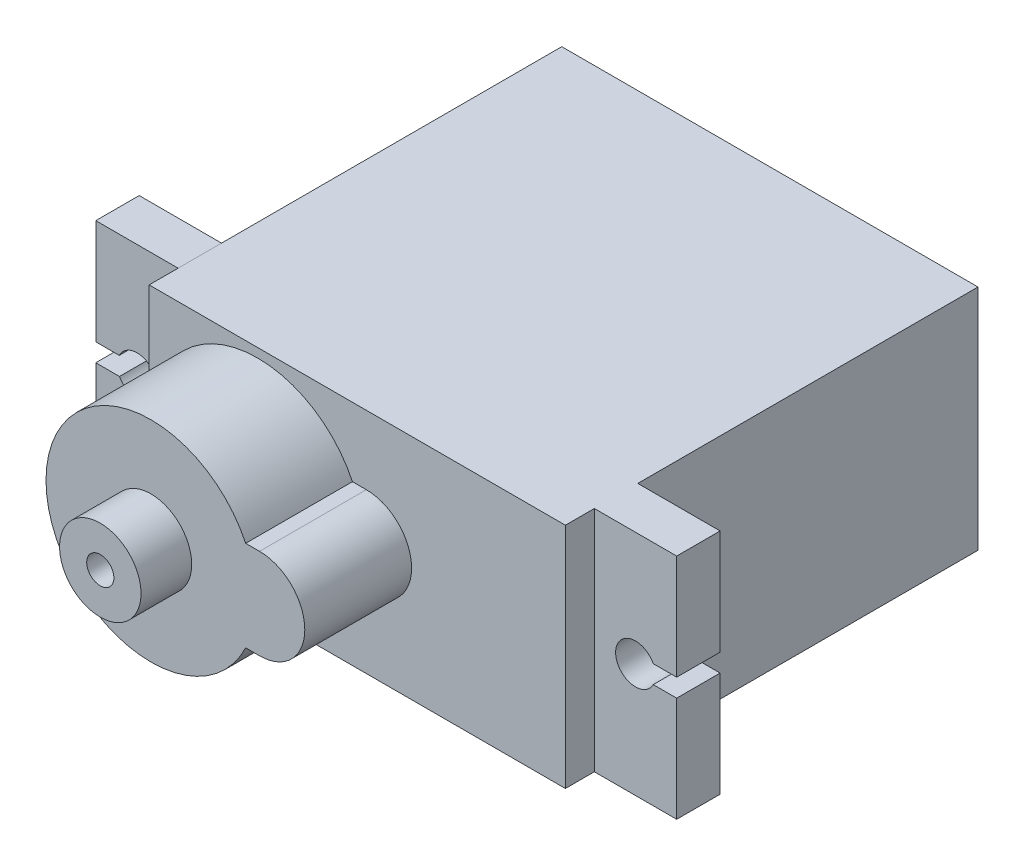
ISO-10303-21;
HEADER;
FILE_DESCRIPTION(('STEP AP214'),'2;1');
FILE_NAME('part.step','',(''),(''),'','','');
FILE_SCHEMA(('AUTOMOTIVE_DESIGN { 1 0 10303 214 1 1 1 1 }'));
ENDSEC;
DATA;
#1=APPLICATION_CONTEXT('core data for automotive mechanical design processes');
#2=APPLICATION_PROTOCOL_DEFINITION('international standard','automotive_design',2000,#1);
#3=PRODUCT_CONTEXT('',#1,'mechanical');
#4=PRODUCT('Part','Part','',(#3));
#5=PRODUCT_RELATED_PRODUCT_CATEGORY('part','',(#4));
#6=PRODUCT_DEFINITION_FORMATION('','',#4);
#7=PRODUCT_DEFINITION_CONTEXT('part definition',#1,'design');
#8=PRODUCT_DEFINITION('design','',#6,#7);
#9=PRODUCT_DEFINITION_SHAPE('','',#8);
#10=(LENGTH_UNIT() NAMED_UNIT(*) SI_UNIT(.MILLI.,.METRE.));
#11=(NAMED_UNIT(*) PLANE_ANGLE_UNIT() SI_UNIT($,.RADIAN.));
#12=(NAMED_UNIT(*) SI_UNIT($,.STERADIAN.) SOLID_ANGLE_UNIT());
#13=UNCERTAINTY_MEASURE_WITH_UNIT(LENGTH_MEASURE(1.E-05),#10,'distance_accuracy_value','');
#14=(GEOMETRIC_REPRESENTATION_CONTEXT(3) GLOBAL_UNCERTAINTY_ASSIGNED_CONTEXT((#13)) GLOBAL_UNIT_ASSIGNED_CONTEXT((#10,
#11,#12)) REPRESENTATION_CONTEXT('',''));
#15=CARTESIAN_POINT('',(0.,0.,0.));
#16=DIRECTION('',(0.,0.,1.));
#17=DIRECTION('',(1.,0.,0.));
#18=AXIS2_PLACEMENT_3D('',#15,#16,#17);
#19=CARTESIAN_POINT('',(11.5,-6.3,0.));
#20=DIRECTION('',(0.,0.,1.));
#21=DIRECTION('',(1.,0.,0.));
#22=AXIS2_PLACEMENT_3D('',#19,#20,#21);
#23=PLANE('',#22);
#24=DIRECTION('',(0.,-1.,0.));
#25=VECTOR('',#24,1.);
#26=CARTESIAN_POINT('',(0.,0.,0.));
#27=LINE('',#26,#25);
#28=CARTESIAN_POINT('',(0.,0.,0.));
#29=VERTEX_POINT('',#28);
#30=CARTESIAN_POINT('',(0.,-12.6,0.));
#31=VERTEX_POINT('',#30);
#32=EDGE_CURVE('E20',#29,#31,#27,.T.);
#33=ORIENTED_EDGE('',*,*,#32,.F.);
#34=DIRECTION('',(-1.,0.,0.));
#35=VECTOR('',#34,1.);
#36=CARTESIAN_POINT('',(23.,0.,0.));
#37=LINE('',#36,#35);
#38=CARTESIAN_POINT('',(23.,0.,0.));
#39=VERTEX_POINT('',#38);
#40=EDGE_CURVE('E426',#39,#29,#37,.T.);
#41=ORIENTED_EDGE('',*,*,#40,.F.);
#42=DIRECTION('',(0.,1.,0.));
#43=VECTOR('',#42,1.);
#44=CARTESIAN_POINT('',(23.,-12.6,0.));
#45=LINE('',#44,#43);
#46=CARTESIAN_POINT('',(23.,-12.6,0.));
#47=VERTEX_POINT('',#46);
#48=EDGE_CURVE('E27',#47,#39,#45,.T.);
#49=ORIENTED_EDGE('',*,*,#48,.F.);
#50=DIRECTION('',(1.,0.,0.));
#51=VECTOR('',#50,1.);
#52=CARTESIAN_POINT('',(0.,-12.6,0.));
#53=LINE('',#52,#51);
#54=EDGE_CURVE('E10',#31,#47,#53,.T.);
#55=ORIENTED_EDGE('',*,*,#54,.F.);
#56=EDGE_LOOP('',(#33,#41,#49,#55));
#57=FACE_BOUND('',#56,.T.);
#58=ADVANCED_FACE('F16',(#57),#23,.F.);
#59=CARTESIAN_POINT('',(11.5,-12.6,0.));
#60=DIRECTION('',(0.,-1.,0.));
#61=DIRECTION('',(0.,0.,-1.));
#62=AXIS2_PLACEMENT_3D('',#59,#60,#61);
#63=PLANE('',#62);
#64=DIRECTION('',(0.,0.,1.));
#65=VECTOR('',#64,1.);
#66=CARTESIAN_POINT('',(23.,-12.6,0.));
#67=LINE('',#66,#65);
#68=CARTESIAN_POINT('',(23.,-12.6,18.8));
#69=VERTEX_POINT('',#68);
#70=EDGE_CURVE('E192',#47,#69,#67,.T.);
#71=ORIENTED_EDGE('',*,*,#70,.T.);
#72=DIRECTION('',(1.,0.,0.));
#73=VECTOR('',#72,1.);
#74=CARTESIAN_POINT('',(0.,-12.6,18.8));
#75=LINE('',#74,#73);
#76=CARTESIAN_POINT('',(27.55,-12.6,18.8));
#77=VERTEX_POINT('',#76);
#78=EDGE_CURVE('E302',#69,#77,#75,.T.);
#79=ORIENTED_EDGE('',*,*,#78,.T.);
#80=DIRECTION('',(0.,0.,1.));
#81=VECTOR('',#80,1.);
#82=CARTESIAN_POINT('',(27.55,-12.6,18.8));
#83=LINE('',#82,#81);
#84=CARTESIAN_POINT('',(27.55,-12.6,21.2));
#85=VERTEX_POINT('',#84);
#86=EDGE_CURVE('E364',#77,#85,#83,.T.);
#87=ORIENTED_EDGE('',*,*,#86,.T.);
#88=DIRECTION('',(-1.,0.,0.));
#89=VECTOR('',#88,1.);
#90=CARTESIAN_POINT('',(23.,-12.6,21.2));
#91=LINE('',#90,#89);
#92=CARTESIAN_POINT('',(23.,-12.6,21.2));
#93=VERTEX_POINT('',#92);
#94=EDGE_CURVE('E428',#85,#93,#91,.T.);
#95=ORIENTED_EDGE('',*,*,#94,.T.);
#96=DIRECTION('',(0.,0.,1.));
#97=VECTOR('',#96,1.);
#98=CARTESIAN_POINT('',(23.,-12.6,21.2));
#99=LINE('',#98,#97);
#100=CARTESIAN_POINT('',(23.,-12.6,22.8));
#101=VERTEX_POINT('',#100);
#102=EDGE_CURVE('E393',#93,#101,#99,.T.);
#103=ORIENTED_EDGE('',*,*,#102,.T.);
#104=DIRECTION('',(-1.,0.,0.));
#105=VECTOR('',#104,1.);
#106=CARTESIAN_POINT('',(0.,-12.6,22.8));
#107=LINE('',#106,#105);
#108=CARTESIAN_POINT('',(0.,-12.6,22.8));
#109=VERTEX_POINT('',#108);
#110=EDGE_CURVE('E339',#101,#109,#107,.T.);
#111=ORIENTED_EDGE('',*,*,#110,.T.);
#112=DIRECTION('',(0.,0.,1.));
#113=VECTOR('',#112,1.);
#114=CARTESIAN_POINT('',(0.,-12.6,21.2));
#115=LINE('',#114,#113);
#116=CARTESIAN_POINT('',(0.,-12.6,21.2));
#117=VERTEX_POINT('',#116);
#118=EDGE_CURVE('E284',#117,#109,#115,.T.);
#119=ORIENTED_EDGE('',*,*,#118,.F.);
#120=DIRECTION('',(0.,0.,1.));
#121=VECTOR('',#120,1.);
#122=CARTESIAN_POINT('',(0.,-12.6,18.8));
#123=LINE('',#122,#121);
#124=CARTESIAN_POINT('',(0.,-12.6,18.8));
#125=VERTEX_POINT('',#124);
#126=EDGE_CURVE('E277',#125,#117,#123,.T.);
#127=ORIENTED_EDGE('',*,*,#126,.F.);
#128=DIRECTION('',(0.,0.,1.));
#129=VECTOR('',#128,1.);
#130=CARTESIAN_POINT('',(0.,-12.6,0.));
#131=LINE('',#130,#129);
#132=EDGE_CURVE('E281',#31,#125,#131,.T.);
#133=ORIENTED_EDGE('',*,*,#132,.F.);
#134=ORIENTED_EDGE('',*,*,#54,.T.);
#135=EDGE_LOOP('',(#71,#79,#87,#95,#103,#111,#119,#127,#133,#134));
#136=FACE_BOUND('',#135,.T.);
#137=ADVANCED_FACE('F279',(#136),#63,.T.);
#138=CARTESIAN_POINT('',(23.,-6.3,0.));
#139=DIRECTION('',(1.,0.,0.));
#140=DIRECTION('',(0.,1.,0.));
#141=AXIS2_PLACEMENT_3D('',#138,#139,#140);
#142=PLANE('',#141);
#143=DIRECTION('',(0.,-1.,0.));
#144=VECTOR('',#143,1.);
#145=CARTESIAN_POINT('',(23.,-12.6,18.8));
#146=LINE('',#145,#144);
#147=CARTESIAN_POINT('',(23.,0.,18.8));
#148=VERTEX_POINT('',#147);
#149=EDGE_CURVE('E338',#148,#69,#146,.T.);
#150=ORIENTED_EDGE('',*,*,#149,.T.);
#151=ORIENTED_EDGE('',*,*,#70,.F.);
#152=ORIENTED_EDGE('',*,*,#48,.T.);
#153=DIRECTION('',(0.,0.,1.));
#154=VECTOR('',#153,1.);
#155=CARTESIAN_POINT('',(23.,0.,0.));
#156=LINE('',#155,#154);
#157=EDGE_CURVE('E423',#39,#148,#156,.T.);
#158=ORIENTED_EDGE('',*,*,#157,.T.);
#159=EDGE_LOOP('',(#150,#151,#152,#158));
#160=FACE_BOUND('',#159,.T.);
#161=ADVANCED_FACE('F624',(#160),#142,.T.);
#162=CARTESIAN_POINT('',(11.5,0.,0.));
#163=DIRECTION('',(0.,1.,0.));
#164=DIRECTION('',(1.,0.,0.));
#165=AXIS2_PLACEMENT_3D('',#162,#163,#164);
#166=PLANE('',#165);
#167=DIRECTION('',(0.,0.,1.));
#168=VECTOR('',#167,1.);
#169=CARTESIAN_POINT('',(0.,0.,0.));
#170=LINE('',#169,#168);
#171=CARTESIAN_POINT('',(0.,0.,18.8));
#172=VERTEX_POINT('',#171);
#173=EDGE_CURVE('E319',#29,#172,#170,.T.);
#174=ORIENTED_EDGE('',*,*,#173,.T.);
#175=DIRECTION('',(0.,0.,1.));
#176=VECTOR('',#175,1.);
#177=CARTESIAN_POINT('',(0.,0.,18.8));
#178=LINE('',#177,#176);
#179=CARTESIAN_POINT('',(0.,0.,21.2));
#180=VERTEX_POINT('',#179);
#181=EDGE_CURVE('E344',#172,#180,#178,.T.);
#182=ORIENTED_EDGE('',*,*,#181,.T.);
#183=DIRECTION('',(0.,0.,1.));
#184=VECTOR('',#183,1.);
#185=CARTESIAN_POINT('',(0.,0.,21.2));
#186=LINE('',#185,#184);
#187=CARTESIAN_POINT('',(0.,0.,22.8));
#188=VERTEX_POINT('',#187);
#189=EDGE_CURVE('E486',#180,#188,#186,.T.);
#190=ORIENTED_EDGE('',*,*,#189,.T.);
#191=DIRECTION('',(1.,0.,0.));
#192=VECTOR('',#191,1.);
#193=CARTESIAN_POINT('',(23.,0.,22.8));
#194=LINE('',#193,#192);
#195=CARTESIAN_POINT('',(23.,0.,22.8));
#196=VERTEX_POINT('',#195);
#197=EDGE_CURVE('E343',#188,#196,#194,.T.);
#198=ORIENTED_EDGE('',*,*,#197,.T.);
#199=DIRECTION('',(0.,0.,1.));
#200=VECTOR('',#199,1.);
#201=CARTESIAN_POINT('',(23.,0.,21.2));
#202=LINE('',#201,#200);
#203=CARTESIAN_POINT('',(23.,0.,21.2));
#204=VERTEX_POINT('',#203);
#205=EDGE_CURVE('E412',#204,#196,#202,.T.);
#206=ORIENTED_EDGE('',*,*,#205,.F.);
#207=DIRECTION('',(1.,0.,0.));
#208=VECTOR('',#207,1.);
#209=CARTESIAN_POINT('',(23.,0.,21.2));
#210=LINE('',#209,#208);
#211=CARTESIAN_POINT('',(27.55,0.,21.2));
#212=VERTEX_POINT('',#211);
#213=EDGE_CURVE('E427',#204,#212,#210,.T.);
#214=ORIENTED_EDGE('',*,*,#213,.T.);
#215=DIRECTION('',(0.,0.,1.));
#216=VECTOR('',#215,1.);
#217=CARTESIAN_POINT('',(27.55,0.,18.8));
#218=LINE('',#217,#216);
#219=CARTESIAN_POINT('',(27.55,0.,18.8));
#220=VERTEX_POINT('',#219);
#221=EDGE_CURVE('E183',#220,#212,#218,.T.);
#222=ORIENTED_EDGE('',*,*,#221,.F.);
#223=DIRECTION('',(-1.,0.,0.));
#224=VECTOR('',#223,1.);
#225=CARTESIAN_POINT('',(27.55,0.,18.8));
#226=LINE('',#225,#224);
#227=EDGE_CURVE('E334',#220,#148,#226,.T.);
#228=ORIENTED_EDGE('',*,*,#227,.T.);
#229=ORIENTED_EDGE('',*,*,#157,.F.);
#230=ORIENTED_EDGE('',*,*,#40,.T.);
#231=EDGE_LOOP('',(#174,#182,#190,#198,#206,#214,#222,#228,#229,#230));
#232=FACE_BOUND('',#231,.T.);
#233=ADVANCED_FACE('F594',(#232),#166,.T.);
#234=CARTESIAN_POINT('',(11.4981211475471,-6.29913591463566,21.2));
#235=DIRECTION('',(0.,0.,1.));
#236=DIRECTION('',(0.,-1.,0.));
#237=AXIS2_PLACEMENT_3D('',#234,#235,#236);
#238=PLANE('',#237);
#239=DIRECTION('',(0.,-1.,0.));
#240=VECTOR('',#239,1.);
#241=CARTESIAN_POINT('',(23.,-6.29956795731783,21.2));
#242=LINE('',#241,#240);
#243=EDGE_CURVE('E417',#204,#93,#242,.T.);
#244=ORIENTED_EDGE('',*,*,#243,.T.);
#245=ORIENTED_EDGE('',*,*,#94,.F.);
#246=DIRECTION('',(0.,-1.,0.));
#247=VECTOR('',#246,1.);
#248=CARTESIAN_POINT('',(27.55,-12.6,21.2));
#249=LINE('',#248,#247);
#250=CARTESIAN_POINT('',(27.55,-6.8,21.2));
#251=VERTEX_POINT('',#250);
#252=EDGE_CURVE('E360',#251,#85,#249,.T.);
#253=ORIENTED_EDGE('',*,*,#252,.F.);
#254=DIRECTION('',(1.,0.,0.));
#255=VECTOR('',#254,1.);
#256=CARTESIAN_POINT('',(27.55,-6.8,21.2));
#257=LINE('',#256,#255);
#258=CARTESIAN_POINT('',(26.2547958971133,-6.8,21.2));
#259=VERTEX_POINT('',#258);
#260=EDGE_CURVE('E398',#259,#251,#257,.T.);
#261=ORIENTED_EDGE('',*,*,#260,.F.);
#262=CARTESIAN_POINT('',(25.275,-6.3,21.2));
#263=DIRECTION('',(0.,0.,1.));
#264=DIRECTION('',(1.,0.,0.));
#265=AXIS2_PLACEMENT_3D('',#262,#263,#264);
#266=CIRCLE('',#265,1.1);
#267=CARTESIAN_POINT('',(26.2547958971133,-5.8,21.2));
#268=VERTEX_POINT('',#267);
#269=EDGE_CURVE('E411',#268,#259,#266,.T.);
#270=ORIENTED_EDGE('',*,*,#269,.F.);
#271=DIRECTION('',(-1.,0.,0.));
#272=VECTOR('',#271,1.);
#273=CARTESIAN_POINT('',(26.2547958971133,-5.8,21.2));
#274=LINE('',#273,#272);
#275=CARTESIAN_POINT('',(27.55,-5.8,21.2));
#276=VERTEX_POINT('',#275);
#277=EDGE_CURVE('E373',#276,#268,#274,.T.);
#278=ORIENTED_EDGE('',*,*,#277,.F.);
#279=DIRECTION('',(0.,-1.,0.));
#280=VECTOR('',#279,1.);
#281=CARTESIAN_POINT('',(27.55,-5.8,21.2));
#282=LINE('',#281,#280);
#283=EDGE_CURVE('E348',#212,#276,#282,.T.);
#284=ORIENTED_EDGE('',*,*,#283,.F.);
#285=ORIENTED_EDGE('',*,*,#213,.F.);
#286=EDGE_LOOP('',(#244,#245,#253,#261,#270,#278,#284,#285));
#287=FACE_BOUND('',#286,.T.);
#288=ADVANCED_FACE('F613',(#287),#238,.T.);
#289=CARTESIAN_POINT('',(27.55,-9.7,18.8));
#290=DIRECTION('',(1.,0.,0.));
#291=DIRECTION('',(0.,-1.,0.));
#292=AXIS2_PLACEMENT_3D('',#289,#290,#291);
#293=PLANE('',#292);
#294=ORIENTED_EDGE('',*,*,#252,.T.);
#295=ORIENTED_EDGE('',*,*,#86,.F.);
#296=DIRECTION('',(0.,1.,0.));
#297=VECTOR('',#296,1.);
#298=CARTESIAN_POINT('',(27.55,-12.6,18.8));
#299=LINE('',#298,#297);
#300=CARTESIAN_POINT('',(27.55,-6.8,18.8));
#301=VERTEX_POINT('',#300);
#302=EDGE_CURVE('E384',#77,#301,#299,.T.);
#303=ORIENTED_EDGE('',*,*,#302,.T.);
#304=DIRECTION('',(0.,0.,1.));
#305=VECTOR('',#304,1.);
#306=CARTESIAN_POINT('',(27.55,-6.8,18.8));
#307=LINE('',#306,#305);
#308=EDGE_CURVE('E365',#301,#251,#307,.T.);
#309=ORIENTED_EDGE('',*,*,#308,.T.);
#310=EDGE_LOOP('',(#294,#295,#303,#309));
#311=FACE_BOUND('',#310,.T.);
#312=ADVANCED_FACE('F925',(#311),#293,.T.);
#313=CARTESIAN_POINT('',(26.9023979485566,-6.8,18.8));
#314=DIRECTION('',(0.,1.,0.));
#315=DIRECTION('',(1.,0.,0.));
#316=AXIS2_PLACEMENT_3D('',#313,#314,#315);
#317=PLANE('',#316);
#318=ORIENTED_EDGE('',*,*,#260,.T.);
#319=ORIENTED_EDGE('',*,*,#308,.F.);
#320=DIRECTION('',(-1.,0.,0.));
#321=VECTOR('',#320,1.);
#322=CARTESIAN_POINT('',(27.55,-6.8,18.8));
#323=LINE('',#322,#321);
#324=CARTESIAN_POINT('',(26.2547958971133,-6.8,18.8));
#325=VERTEX_POINT('',#324);
#326=EDGE_CURVE('E387',#301,#325,#323,.T.);
#327=ORIENTED_EDGE('',*,*,#326,.T.);
#328=DIRECTION('',(0.,0.,1.));
#329=VECTOR('',#328,1.);
#330=CARTESIAN_POINT('',(26.2547958971133,-6.8,18.8));
#331=LINE('',#330,#329);
#332=EDGE_CURVE('E407',#325,#259,#331,.T.);
#333=ORIENTED_EDGE('',*,*,#332,.T.);
#334=EDGE_LOOP('',(#318,#319,#327,#333));
#335=FACE_BOUND('',#334,.T.);
#336=ADVANCED_FACE('F928',(#335),#317,.T.);
#337=CARTESIAN_POINT('',(25.275,-6.3,18.8));
#338=DIRECTION('',(0.,0.,1.));
#339=DIRECTION('',(1.,0.,0.));
#340=AXIS2_PLACEMENT_3D('',#337,#338,#339);
#341=CYLINDRICAL_SURFACE('',#340,1.1);
#342=ORIENTED_EDGE('',*,*,#269,.T.);
#343=ORIENTED_EDGE('',*,*,#332,.F.);
#344=CARTESIAN_POINT('',(25.275,-6.3,18.8));
#345=DIRECTION('',(0.,0.,1.));
#346=DIRECTION('',(1.,0.,0.));
#347=AXIS2_PLACEMENT_3D('',#344,#345,#346);
#348=CIRCLE('',#347,1.1);
#349=CARTESIAN_POINT('',(26.2547958971133,-5.8,18.8));
#350=VERTEX_POINT('',#349);
#351=EDGE_CURVE('E422',#350,#325,#348,.T.);
#352=ORIENTED_EDGE('',*,*,#351,.F.);
#353=DIRECTION('',(0.,0.,1.));
#354=VECTOR('',#353,1.);
#355=CARTESIAN_POINT('',(26.2547958971133,-5.8,18.8));
#356=LINE('',#355,#354);
#357=EDGE_CURVE('E377',#350,#268,#356,.T.);
#358=ORIENTED_EDGE('',*,*,#357,.T.);
#359=EDGE_LOOP('',(#342,#343,#352,#358));
#360=FACE_BOUND('',#359,.T.);
#361=ADVANCED_FACE('F942',(#360),#341,.F.);
#362=CARTESIAN_POINT('',(26.9023979485566,-5.8,18.8));
#363=DIRECTION('',(0.,-1.,0.));
#364=DIRECTION('',(-1.,0.,0.));
#365=AXIS2_PLACEMENT_3D('',#362,#363,#364);
#366=PLANE('',#365);
#367=ORIENTED_EDGE('',*,*,#277,.T.);
#368=ORIENTED_EDGE('',*,*,#357,.F.);
#369=DIRECTION('',(1.,0.,0.));
#370=VECTOR('',#369,1.);
#371=CARTESIAN_POINT('',(26.2547958971133,-5.8,18.8));
#372=LINE('',#371,#370);
#373=CARTESIAN_POINT('',(27.55,-5.8,18.8));
#374=VERTEX_POINT('',#373);
#375=EDGE_CURVE('E418',#350,#374,#372,.T.);
#376=ORIENTED_EDGE('',*,*,#375,.T.);
#377=DIRECTION('',(0.,0.,1.));
#378=VECTOR('',#377,1.);
#379=CARTESIAN_POINT('',(27.55,-5.8,18.8));
#380=LINE('',#379,#378);
#381=EDGE_CURVE('E406',#374,#276,#380,.T.);
#382=ORIENTED_EDGE('',*,*,#381,.T.);
#383=EDGE_LOOP('',(#367,#368,#376,#382));
#384=FACE_BOUND('',#383,.T.);
#385=ADVANCED_FACE('F615',(#384),#366,.T.);
#386=CARTESIAN_POINT('',(27.55,-2.9,18.8));
#387=DIRECTION('',(1.,0.,0.));
#388=DIRECTION('',(0.,-1.,0.));
#389=AXIS2_PLACEMENT_3D('',#386,#387,#388);
#390=PLANE('',#389);
#391=ORIENTED_EDGE('',*,*,#283,.T.);
#392=ORIENTED_EDGE('',*,*,#381,.F.);
#393=DIRECTION('',(0.,1.,0.));
#394=VECTOR('',#393,1.);
#395=CARTESIAN_POINT('',(27.55,-5.8,18.8));
#396=LINE('',#395,#394);
#397=EDGE_CURVE('E337',#374,#220,#396,.T.);
#398=ORIENTED_EDGE('',*,*,#397,.T.);
#399=ORIENTED_EDGE('',*,*,#221,.T.);
#400=EDGE_LOOP('',(#391,#392,#398,#399));
#401=FACE_BOUND('',#400,.T.);
#402=ADVANCED_FACE('F610',(#401),#390,.T.);
#403=CARTESIAN_POINT('',(-2.27499999862206,7.91809040237242E-05,18.8));
#404=DIRECTION('',(3.48047929774612E-05,0.999999999394313,0.));
#405=DIRECTION('',(0.,0.,-1.));
#406=AXIS2_PLACEMENT_3D('',#403,#404,#405);
#407=PLANE('',#406);
#408=DIRECTION('',(0.999999999394313,-3.48047929774612E-05,0.));
#409=VECTOR('',#408,1.);
#410=CARTESIAN_POINT('',(0.,0.,21.2));
#411=LINE('',#410,#409);
#412=CARTESIAN_POINT('',(-4.54999999724413,0.000158361808047448,21.2));
#413=VERTEX_POINT('',#412);
#414=EDGE_CURVE('E342',#413,#180,#411,.T.);
#415=ORIENTED_EDGE('',*,*,#414,.T.);
#416=ORIENTED_EDGE('',*,*,#181,.F.);
#417=DIRECTION('',(-0.999999999394313,3.48047929774612E-05,0.));
#418=VECTOR('',#417,1.);
#419=CARTESIAN_POINT('',(0.,0.,18.8));
#420=LINE('',#419,#418);
#421=CARTESIAN_POINT('',(-4.54999999724413,0.000158361808047448,18.8));
#422=VERTEX_POINT('',#421);
#423=EDGE_CURVE('E316',#172,#422,#420,.T.);
#424=ORIENTED_EDGE('',*,*,#423,.T.);
#425=DIRECTION('',(0.,0.,1.));
#426=VECTOR('',#425,1.);
#427=CARTESIAN_POINT('',(-4.54999999724413,0.000158361808047448,18.8));
#428=LINE('',#427,#426);
#429=EDGE_CURVE('E349',#422,#413,#428,.T.);
#430=ORIENTED_EDGE('',*,*,#429,.T.);
#431=EDGE_LOOP('',(#415,#416,#424,#430));
#432=FACE_BOUND('',#431,.T.);
#433=ADVANCED_FACE('F951',(#432),#407,.T.);
#434=CARTESIAN_POINT('',(-4.55010094105764,-2.9001264788859,18.8));
#435=DIRECTION('',(-0.999999999394313,3.48047929774613E-05,0.));
#436=DIRECTION('',(0.,0.,1.));
#437=AXIS2_PLACEMENT_3D('',#434,#435,#436);
#438=PLANE('',#437);
#439=DIRECTION('',(3.48047929774613E-05,0.999999999394313,0.));
#440=VECTOR('',#439,1.);
#441=CARTESIAN_POINT('',(-4.54999999724413,0.000158361808047448,21.2));
#442=LINE('',#441,#440);
#443=CARTESIAN_POINT('',(-4.55020188487116,-5.80041131957985,21.2));
#444=VERTEX_POINT('',#443);
#445=EDGE_CURVE('E355',#444,#413,#442,.T.);
#446=ORIENTED_EDGE('',*,*,#445,.T.);
#447=ORIENTED_EDGE('',*,*,#429,.F.);
#448=DIRECTION('',(-3.48047929774613E-05,-0.999999999394313,0.));
#449=VECTOR('',#448,1.);
#450=CARTESIAN_POINT('',(-4.54999999724413,0.000158361808047448,18.8));
#451=LINE('',#450,#449);
#452=CARTESIAN_POINT('',(-4.55020188487116,-5.80041131957985,18.8));
#453=VERTEX_POINT('',#452);
#454=EDGE_CURVE('E433',#422,#453,#451,.T.);
#455=ORIENTED_EDGE('',*,*,#454,.T.);
#456=DIRECTION('',(0.,0.,1.));
#457=VECTOR('',#456,1.);
#458=CARTESIAN_POINT('',(-4.55020188487116,-5.80041131957985,18.8));
#459=LINE('',#458,#457);
#460=EDGE_CURVE('E476',#453,#444,#459,.T.);
#461=ORIENTED_EDGE('',*,*,#460,.T.);
#462=EDGE_LOOP('',(#446,#447,#455,#461));
#463=FACE_BOUND('',#462,.T.);
#464=ADVANCED_FACE('F954',(#463),#438,.T.);
#465=CARTESIAN_POINT('',(-3.90245260923942,-5.80041131957985,18.8));
#466=DIRECTION('',(0.,-1.,0.));
#467=DIRECTION('',(0.,0.,-1.));
#468=AXIS2_PLACEMENT_3D('',#465,#466,#467);
#469=PLANE('',#468);
#470=DIRECTION('',(-1.,0.,0.));
#471=VECTOR('',#470,1.);
#472=CARTESIAN_POINT('',(-4.55020188487116,-5.80041131957985,21.2));
#473=LINE('',#472,#471);
#474=CARTESIAN_POINT('',(-3.25470333360768,-5.80041131957985,21.2));
#475=VERTEX_POINT('',#474);
#476=EDGE_CURVE('E359',#475,#444,#473,.T.);
#477=ORIENTED_EDGE('',*,*,#476,.T.);
#478=ORIENTED_EDGE('',*,*,#460,.F.);
#479=DIRECTION('',(1.,0.,0.));
#480=VECTOR('',#479,1.);
#481=CARTESIAN_POINT('',(-4.55020188487116,-5.80041131957985,18.8));
#482=LINE('',#481,#480);
#483=CARTESIAN_POINT('',(-3.25470333360768,-5.80041131957985,18.8));
#484=VERTEX_POINT('',#483);
#485=EDGE_CURVE('E551',#453,#484,#482,.T.);
#486=ORIENTED_EDGE('',*,*,#485,.T.);
#487=DIRECTION('',(0.,0.,1.));
#488=VECTOR('',#487,1.);
#489=CARTESIAN_POINT('',(-3.25470333360768,-5.80041131957985,18.8));
#490=LINE('',#489,#488);
#491=EDGE_CURVE('E479',#484,#475,#490,.T.);
#492=ORIENTED_EDGE('',*,*,#491,.T.);
#493=EDGE_LOOP('',(#477,#478,#486,#492));
#494=FACE_BOUND('',#493,.T.);
#495=ADVANCED_FACE('F973',(#494),#469,.T.);
#496=CARTESIAN_POINT('',(-2.26713157200201,-6.28487186046948,18.8));
#497=DIRECTION('',(0.,0.,1.));
#498=DIRECTION('',(1.,0.,0.));
#499=AXIS2_PLACEMENT_3D('',#496,#497,#498);
#500=CYLINDRICAL_SURFACE('',#499,1.1);
#501=CARTESIAN_POINT('',(-2.26713157200201,-6.28487186046948,21.2));
#502=DIRECTION('',(0.,0.,1.));
#503=DIRECTION('',(1.,0.,0.));
#504=AXIS2_PLACEMENT_3D('',#501,#502,#503);
#505=CIRCLE('',#504,1.1);
#506=CARTESIAN_POINT('',(-3.23884092468942,-6.80041131957985,21.2));
#507=VERTEX_POINT('',#506);
#508=EDGE_CURVE('E470',#507,#475,#505,.T.);
#509=ORIENTED_EDGE('',*,*,#508,.T.);
#510=ORIENTED_EDGE('',*,*,#491,.F.);
#511=CARTESIAN_POINT('',(-2.26713157200201,-6.28487186046948,18.8));
#512=DIRECTION('',(0.,0.,1.));
#513=DIRECTION('',(1.,0.,0.));
#514=AXIS2_PLACEMENT_3D('',#511,#512,#513);
#515=CIRCLE('',#514,1.1);
#516=CARTESIAN_POINT('',(-3.23884092468942,-6.80041131957985,18.8));
#517=VERTEX_POINT('',#516);
#518=EDGE_CURVE('E372',#517,#484,#515,.T.);
#519=ORIENTED_EDGE('',*,*,#518,.F.);
#520=DIRECTION('',(0.,0.,1.));
#521=VECTOR('',#520,1.);
#522=CARTESIAN_POINT('',(-3.23884092468942,-6.80041131957985,18.8));
#523=LINE('',#522,#521);
#524=EDGE_CURVE('E491',#517,#507,#523,.T.);
#525=ORIENTED_EDGE('',*,*,#524,.T.);
#526=EDGE_LOOP('',(#509,#510,#519,#525));
#527=FACE_BOUND('',#526,.T.);
#528=ADVANCED_FACE('F966',(#527),#500,.F.);
#529=CARTESIAN_POINT('',(-3.89452140478029,-6.80041131957985,18.8));
#530=DIRECTION('',(0.,1.,0.));
#531=DIRECTION('',(1.,0.,0.));
#532=AXIS2_PLACEMENT_3D('',#529,#530,#531);
#533=PLANE('',#532);
#534=DIRECTION('',(1.,0.,0.));
#535=VECTOR('',#534,1.);
#536=CARTESIAN_POINT('',(-3.23884092468942,-6.80041131957985,21.2));
#537=LINE('',#536,#535);
#538=CARTESIAN_POINT('',(-4.55020188487116,-6.80041131957985,21.2));
#539=VERTEX_POINT('',#538);
#540=EDGE_CURVE('E469',#539,#507,#537,.T.);
#541=ORIENTED_EDGE('',*,*,#540,.T.);
#542=ORIENTED_EDGE('',*,*,#524,.F.);
#543=DIRECTION('',(-1.,0.,0.));
#544=VECTOR('',#543,1.);
#545=CARTESIAN_POINT('',(-3.23884092468942,-6.80041131957985,18.8));
#546=LINE('',#545,#544);
#547=CARTESIAN_POINT('',(-4.55020188487116,-6.80041131957985,18.8));
#548=VERTEX_POINT('',#547);
#549=EDGE_CURVE('E368',#517,#548,#546,.T.);
#550=ORIENTED_EDGE('',*,*,#549,.T.);
#551=DIRECTION('',(0.,0.,1.));
#552=VECTOR('',#551,1.);
#553=CARTESIAN_POINT('',(-4.55020188487116,-6.80041131957985,18.8));
#554=LINE('',#553,#552);
#555=EDGE_CURVE('E290',#548,#539,#554,.T.);
#556=ORIENTED_EDGE('',*,*,#555,.T.);
#557=EDGE_LOOP('',(#541,#542,#550,#556));
#558=FACE_BOUND('',#557,.T.);
#559=ADVANCED_FACE('F963',(#558),#533,.T.);
#560=CARTESIAN_POINT('',(-4.55010094243554,-9.7001264788859,18.8));
#561=DIRECTION('',(-0.999999999394092,-3.48111555832287E-05,0.));
#562=DIRECTION('',(-3.48111555832287E-05,0.999999999394092,0.));
#563=AXIS2_PLACEMENT_3D('',#560,#561,#562);
#564=PLANE('',#563);
#565=DIRECTION('',(-3.48111555832287E-05,0.999999999394092,0.));
#566=VECTOR('',#565,1.);
#567=CARTESIAN_POINT('',(-4.55020188487116,-6.80041131957985,21.2));
#568=LINE('',#567,#566);
#569=CARTESIAN_POINT('',(-4.54999999999992,-12.599841638192,21.2));
#570=VERTEX_POINT('',#569);
#571=EDGE_CURVE('E465',#570,#539,#568,.T.);
#572=ORIENTED_EDGE('',*,*,#571,.T.);
#573=ORIENTED_EDGE('',*,*,#555,.F.);
#574=DIRECTION('',(3.48111555832287E-05,-0.999999999394092,0.));
#575=VECTOR('',#574,1.);
#576=CARTESIAN_POINT('',(-4.55020188487116,-6.80041131957985,18.8));
#577=LINE('',#576,#575);
#578=CARTESIAN_POINT('',(-4.54999999999992,-12.599841638192,18.8));
#579=VERTEX_POINT('',#578);
#580=EDGE_CURVE('E301',#548,#579,#577,.T.);
#581=ORIENTED_EDGE('',*,*,#580,.T.);
#582=DIRECTION('',(0.,0.,1.));
#583=VECTOR('',#582,1.);
#584=CARTESIAN_POINT('',(-4.54999999999992,-12.599841638192,18.8));
#585=LINE('',#584,#583);
#586=EDGE_CURVE('E291',#579,#570,#585,.T.);
#587=ORIENTED_EDGE('',*,*,#586,.T.);
#588=EDGE_LOOP('',(#572,#573,#581,#587));
#589=FACE_BOUND('',#588,.T.);
#590=ADVANCED_FACE('F965',(#589),#564,.T.);
#591=CARTESIAN_POINT('',(-2.27499999999996,-12.599920819096,18.8));
#592=DIRECTION('',(-3.48047929505132E-05,-0.999999999394313,0.));
#593=DIRECTION('',(-0.999999999394313,3.48047929505132E-05,0.));
#594=AXIS2_PLACEMENT_3D('',#591,#592,#593);
#595=PLANE('',#594);
#596=DIRECTION('',(-0.999999999394313,3.48047929505132E-05,0.));
#597=VECTOR('',#596,1.);
#598=CARTESIAN_POINT('',(-4.54999999999992,-12.599841638192,21.2));
#599=LINE('',#598,#597);
#600=EDGE_CURVE('E402',#117,#570,#599,.T.);
#601=ORIENTED_EDGE('',*,*,#600,.T.);
#602=ORIENTED_EDGE('',*,*,#586,.F.);
#603=DIRECTION('',(0.999999999394313,-3.48047929505132E-05,0.));
#604=VECTOR('',#603,1.);
#605=CARTESIAN_POINT('',(-4.54999999999992,-12.599841638192,18.8));
#606=LINE('',#605,#604);
#607=EDGE_CURVE('E294',#579,#125,#606,.T.);
#608=ORIENTED_EDGE('',*,*,#607,.T.);
#609=ORIENTED_EDGE('',*,*,#126,.T.);
#610=EDGE_LOOP('',(#601,#602,#608,#609));
#611=FACE_BOUND('',#610,.T.);
#612=ADVANCED_FACE('F295',(#611),#595,.T.);
#613=CARTESIAN_POINT('',(11.4981211475471,-6.29913591463566,18.8));
#614=DIRECTION('',(0.,0.,1.));
#615=DIRECTION('',(0.,-1.,0.));
#616=AXIS2_PLACEMENT_3D('',#613,#614,#615);
#617=PLANE('',#616);
#618=DIRECTION('',(0.,1.,0.));
#619=VECTOR('',#618,1.);
#620=CARTESIAN_POINT('',(0.,0.,18.8));
#621=LINE('',#620,#619);
#622=EDGE_CURVE('E309',#125,#172,#621,.T.);
#623=ORIENTED_EDGE('',*,*,#622,.F.);
#624=ORIENTED_EDGE('',*,*,#607,.F.);
#625=ORIENTED_EDGE('',*,*,#580,.F.);
#626=ORIENTED_EDGE('',*,*,#549,.F.);
#627=ORIENTED_EDGE('',*,*,#518,.T.);
#628=ORIENTED_EDGE('',*,*,#485,.F.);
#629=ORIENTED_EDGE('',*,*,#454,.F.);
#630=ORIENTED_EDGE('',*,*,#423,.F.);
#631=EDGE_LOOP('',(#623,#624,#625,#626,#627,#628,#629,#630));
#632=FACE_BOUND('',#631,.T.);
#633=ADVANCED_FACE('F313',(#632),#617,.F.);
#634=CARTESIAN_POINT('',(11.4981211475471,-6.29913591463566,18.8));
#635=DIRECTION('',(0.,0.,1.));
#636=DIRECTION('',(0.,-1.,0.));
#637=AXIS2_PLACEMENT_3D('',#634,#635,#636);
#638=PLANE('',#637);
#639=ORIENTED_EDGE('',*,*,#149,.F.);
#640=ORIENTED_EDGE('',*,*,#227,.F.);
#641=ORIENTED_EDGE('',*,*,#397,.F.);
#642=ORIENTED_EDGE('',*,*,#375,.F.);
#643=ORIENTED_EDGE('',*,*,#351,.T.);
#644=ORIENTED_EDGE('',*,*,#326,.F.);
#645=ORIENTED_EDGE('',*,*,#302,.F.);
#646=ORIENTED_EDGE('',*,*,#78,.F.);
#647=EDGE_LOOP('',(#639,#640,#641,#642,#643,#644,#645,#646));
#648=FACE_BOUND('',#647,.T.);
#649=ADVANCED_FACE('F620',(#648),#638,.F.);
#650=CARTESIAN_POINT('',(11.4981211475471,-6.29913591463566,21.2));
#651=DIRECTION('',(0.,0.,1.));
#652=DIRECTION('',(0.,-1.,0.));
#653=AXIS2_PLACEMENT_3D('',#650,#651,#652);
#654=PLANE('',#653);
#655=DIRECTION('',(0.,1.,0.));
#656=VECTOR('',#655,1.);
#657=CARTESIAN_POINT('',(0.,-6.29956795731783,21.2));
#658=LINE('',#657,#656);
#659=EDGE_CURVE('E452',#117,#180,#658,.T.);
#660=ORIENTED_EDGE('',*,*,#659,.T.);
#661=ORIENTED_EDGE('',*,*,#414,.F.);
#662=ORIENTED_EDGE('',*,*,#445,.F.);
#663=ORIENTED_EDGE('',*,*,#476,.F.);
#664=ORIENTED_EDGE('',*,*,#508,.F.);
#665=ORIENTED_EDGE('',*,*,#540,.F.);
#666=ORIENTED_EDGE('',*,*,#571,.F.);
#667=ORIENTED_EDGE('',*,*,#600,.F.);
#668=EDGE_LOOP('',(#660,#661,#662,#663,#664,#665,#666,#667));
#669=FACE_BOUND('',#668,.T.);
#670=ADVANCED_FACE('F938',(#669),#654,.T.);
#671=CARTESIAN_POINT('',(11.5,-6.3,22.8));
#672=DIRECTION('',(0.,0.,1.));
#673=DIRECTION('',(0.,-1.,0.));
#674=AXIS2_PLACEMENT_3D('',#671,#672,#673);
#675=PLANE('',#674);
#676=ORIENTED_EDGE('',*,*,#197,.F.);
#677=DIRECTION('',(0.,1.,0.));
#678=VECTOR('',#677,1.);
#679=CARTESIAN_POINT('',(0.,0.,22.8));
#680=LINE('',#679,#678);
#681=EDGE_CURVE('E416',#109,#188,#680,.T.);
#682=ORIENTED_EDGE('',*,*,#681,.F.);
#683=ORIENTED_EDGE('',*,*,#110,.F.);
#684=DIRECTION('',(0.,-1.,0.));
#685=VECTOR('',#684,1.);
#686=CARTESIAN_POINT('',(23.,-12.6,22.8));
#687=LINE('',#686,#685);
#688=EDGE_CURVE('E389',#196,#101,#687,.T.);
#689=ORIENTED_EDGE('',*,*,#688,.F.);
#690=EDGE_LOOP('',(#676,#682,#683,#689));
#691=FACE_BOUND('',#690,.T.);
#692=CARTESIAN_POINT('',(12.,-6.3,22.8));
#693=DIRECTION('',(0.,0.,-1.));
#694=DIRECTION('',(1.,0.,0.));
#695=AXIS2_PLACEMENT_3D('',#692,#693,#694);
#696=CIRCLE('',#695,2.5);
#697=CARTESIAN_POINT('',(12.,-3.8,22.8));
#698=VERTEX_POINT('',#697);
#699=CARTESIAN_POINT('',(12.,-8.8,22.8));
#700=VERTEX_POINT('',#699);
#701=EDGE_CURVE('E383',#698,#700,#696,.T.);
#702=ORIENTED_EDGE('',*,*,#701,.T.);
#703=DIRECTION('',(-1.,0.,0.));
#704=VECTOR('',#703,1.);
#705=CARTESIAN_POINT('',(11.558386410813,-8.8,22.8));
#706=LINE('',#705,#704);
#707=CARTESIAN_POINT('',(11.2335456432518,-8.8,22.8));
#708=VERTEX_POINT('',#707);
#709=EDGE_CURVE('E332',#700,#708,#706,.T.);
#710=ORIENTED_EDGE('',*,*,#709,.T.);
#711=CARTESIAN_POINT('',(6.,-6.3,22.8));
#712=DIRECTION('',(0.,0.,-1.));
#713=DIRECTION('',(1.,0.,0.));
#714=AXIS2_PLACEMENT_3D('',#711,#712,#713);
#715=CIRCLE('',#714,5.8);
#716=CARTESIAN_POINT('',(11.2335456432518,-3.8,22.8));
#717=VERTEX_POINT('',#716);
#718=EDGE_CURVE('E520',#708,#717,#715,.T.);
#719=ORIENTED_EDGE('',*,*,#718,.T.);
#720=DIRECTION('',(1.,0.,0.));
#721=VECTOR('',#720,1.);
#722=CARTESIAN_POINT('',(11.558386410813,-3.8,22.8));
#723=LINE('',#722,#721);
#724=EDGE_CURVE('E394',#717,#698,#723,.T.);
#725=ORIENTED_EDGE('',*,*,#724,.T.);
#726=EDGE_LOOP('',(#702,#710,#719,#725));
#727=FACE_BOUND('',#726,.T.);
#728=ADVANCED_FACE('F600',(#691,#727),#675,.T.);
#729=CARTESIAN_POINT('',(0.,-6.3,21.2));
#730=DIRECTION('',(-1.,0.,0.));
#731=DIRECTION('',(0.,1.,0.));
#732=AXIS2_PLACEMENT_3D('',#729,#730,#731);
#733=PLANE('',#732);
#734=ORIENTED_EDGE('',*,*,#681,.T.);
#735=ORIENTED_EDGE('',*,*,#189,.F.);
#736=ORIENTED_EDGE('',*,*,#659,.F.);
#737=ORIENTED_EDGE('',*,*,#118,.T.);
#738=EDGE_LOOP('',(#734,#735,#736,#737));
#739=FACE_BOUND('',#738,.T.);
#740=ADVANCED_FACE('F598',(#739),#733,.T.);
#741=CARTESIAN_POINT('',(23.,-6.3,21.2));
#742=DIRECTION('',(1.,0.,0.));
#743=DIRECTION('',(0.,0.,-1.));
#744=AXIS2_PLACEMENT_3D('',#741,#742,#743);
#745=PLANE('',#744);
#746=ORIENTED_EDGE('',*,*,#688,.T.);
#747=ORIENTED_EDGE('',*,*,#102,.F.);
#748=ORIENTED_EDGE('',*,*,#243,.F.);
#749=ORIENTED_EDGE('',*,*,#205,.T.);
#750=EDGE_LOOP('',(#746,#747,#748,#749));
#751=FACE_BOUND('',#750,.T.);
#752=ADVANCED_FACE('F605',(#751),#745,.T.);
#753=CARTESIAN_POINT('',(7.38123885854143,-6.3,28.7));
#754=DIRECTION('',(0.,0.,1.));
#755=DIRECTION('',(0.,-1.,0.));
#756=AXIS2_PLACEMENT_3D('',#753,#754,#755);
#757=PLANE('',#756);
#758=CARTESIAN_POINT('',(12.,-6.3,28.7));
#759=DIRECTION('',(0.,0.,-1.));
#760=DIRECTION('',(1.,0.,0.));
#761=AXIS2_PLACEMENT_3D('',#758,#759,#760);
#762=CIRCLE('',#761,2.5);
#763=CARTESIAN_POINT('',(12.,-3.8,28.7));
#764=VERTEX_POINT('',#763);
#765=CARTESIAN_POINT('',(12.,-8.8,28.7));
#766=VERTEX_POINT('',#765);
#767=EDGE_CURVE('E533',#764,#766,#762,.T.);
#768=ORIENTED_EDGE('',*,*,#767,.F.);
#769=DIRECTION('',(1.,0.,0.));
#770=VECTOR('',#769,1.);
#771=CARTESIAN_POINT('',(12.,-3.8,28.7));
#772=LINE('',#771,#770);
#773=CARTESIAN_POINT('',(11.2335456432518,-3.8,28.7));
#774=VERTEX_POINT('',#773);
#775=EDGE_CURVE('E527',#774,#764,#772,.T.);
#776=ORIENTED_EDGE('',*,*,#775,.F.);
#777=CARTESIAN_POINT('',(6.,-6.3,28.7));
#778=DIRECTION('',(0.,0.,-1.));
#779=DIRECTION('',(1.,0.,0.));
#780=AXIS2_PLACEMENT_3D('',#777,#778,#779);
#781=CIRCLE('',#780,5.8);
#782=CARTESIAN_POINT('',(11.2335456432518,-8.8,28.7));
#783=VERTEX_POINT('',#782);
#784=EDGE_CURVE('E350',#783,#774,#781,.T.);
#785=ORIENTED_EDGE('',*,*,#784,.F.);
#786=DIRECTION('',(-1.,0.,0.));
#787=VECTOR('',#786,1.);
#788=CARTESIAN_POINT('',(11.2335456432518,-8.8,28.7));
#789=LINE('',#788,#787);
#790=EDGE_CURVE('E382',#766,#783,#789,.T.);
#791=ORIENTED_EDGE('',*,*,#790,.F.);
#792=EDGE_LOOP('',(#768,#776,#785,#791));
#793=FACE_BOUND('',#792,.T.);
#794=CARTESIAN_POINT('',(6.,-6.3,28.7));
#795=DIRECTION('',(0.,0.,-1.));
#796=DIRECTION('',(1.,0.,0.));
#797=AXIS2_PLACEMENT_3D('',#794,#795,#796);
#798=CIRCLE('',#797,2.25);
#799=CARTESIAN_POINT('',(8.25,-6.3,28.7));
#800=VERTEX_POINT('',#799);
#801=EDGE_CURVE('E446',#800,#800,#798,.T.);
#802=ORIENTED_EDGE('',*,*,#801,.T.);
#803=EDGE_LOOP('',(#802));
#804=FACE_BOUND('',#803,.T.);
#805=ADVANCED_FACE('F18',(#793,#804),#757,.T.);
#806=CARTESIAN_POINT('',(11.6167728216259,-3.8,22.8));
#807=DIRECTION('',(0.,1.,0.));
#808=DIRECTION('',(1.,0.,0.));
#809=AXIS2_PLACEMENT_3D('',#806,#807,#808);
#810=PLANE('',#809);
#811=ORIENTED_EDGE('',*,*,#775,.T.);
#812=DIRECTION('',(0.,0.,1.));
#813=VECTOR('',#812,1.);
#814=CARTESIAN_POINT('',(12.,-3.8,22.8));
#815=LINE('',#814,#813);
#816=EDGE_CURVE('E378',#698,#764,#815,.T.);
#817=ORIENTED_EDGE('',*,*,#816,.F.);
#818=ORIENTED_EDGE('',*,*,#724,.F.);
#819=DIRECTION('',(0.,0.,1.));
#820=VECTOR('',#819,1.);
#821=CARTESIAN_POINT('',(11.2335456432518,-3.8,22.8));
#822=LINE('',#821,#820);
#823=EDGE_CURVE('E354',#717,#774,#822,.T.);
#824=ORIENTED_EDGE('',*,*,#823,.T.);
#825=EDGE_LOOP('',(#811,#817,#818,#824));
#826=FACE_BOUND('',#825,.T.);
#827=ADVANCED_FACE('F920',(#826),#810,.T.);
#828=CARTESIAN_POINT('',(6.,-6.3,22.8));
#829=DIRECTION('',(0.,0.,1.));
#830=DIRECTION('',(1.,0.,0.));
#831=AXIS2_PLACEMENT_3D('',#828,#829,#830);
#832=CYLINDRICAL_SURFACE('',#831,5.8);
#833=ORIENTED_EDGE('',*,*,#784,.T.);
#834=ORIENTED_EDGE('',*,*,#823,.F.);
#835=ORIENTED_EDGE('',*,*,#718,.F.);
#836=DIRECTION('',(0.,0.,1.));
#837=VECTOR('',#836,1.);
#838=CARTESIAN_POINT('',(11.2335456432518,-8.8,22.8));
#839=LINE('',#838,#837);
#840=EDGE_CURVE('E500',#708,#783,#839,.T.);
#841=ORIENTED_EDGE('',*,*,#840,.T.);
#842=EDGE_LOOP('',(#833,#834,#835,#841));
#843=FACE_BOUND('',#842,.T.);
#844=ADVANCED_FACE('F923',(#843),#832,.T.);
#845=CARTESIAN_POINT('',(11.6167728216259,-8.8,22.8));
#846=DIRECTION('',(0.,-1.,0.));
#847=DIRECTION('',(0.,0.,-1.));
#848=AXIS2_PLACEMENT_3D('',#845,#846,#847);
#849=PLANE('',#848);
#850=ORIENTED_EDGE('',*,*,#790,.T.);
#851=ORIENTED_EDGE('',*,*,#840,.F.);
#852=ORIENTED_EDGE('',*,*,#709,.F.);
#853=DIRECTION('',(0.,0.,1.));
#854=VECTOR('',#853,1.);
#855=CARTESIAN_POINT('',(12.,-8.8,22.8));
#856=LINE('',#855,#854);
#857=EDGE_CURVE('E524',#700,#766,#856,.T.);
#858=ORIENTED_EDGE('',*,*,#857,.T.);
#859=EDGE_LOOP('',(#850,#851,#852,#858));
#860=FACE_BOUND('',#859,.T.);
#861=ADVANCED_FACE('F907',(#860),#849,.T.);
#862=CARTESIAN_POINT('',(12.,-6.3,22.8));
#863=DIRECTION('',(0.,0.,1.));
#864=DIRECTION('',(1.,0.,0.));
#865=AXIS2_PLACEMENT_3D('',#862,#863,#864);
#866=CYLINDRICAL_SURFACE('',#865,2.5);
#867=ORIENTED_EDGE('',*,*,#767,.T.);
#868=ORIENTED_EDGE('',*,*,#857,.F.);
#869=ORIENTED_EDGE('',*,*,#701,.F.);
#870=ORIENTED_EDGE('',*,*,#816,.T.);
#871=EDGE_LOOP('',(#867,#868,#869,#870));
#872=FACE_BOUND('',#871,.T.);
#873=ADVANCED_FACE('F893',(#872),#866,.T.);
#874=CARTESIAN_POINT('',(7.38123885854143,-6.3,28.7));
#875=DIRECTION('',(0.,0.,1.));
#876=DIRECTION('',(0.,-1.,0.));
#877=AXIS2_PLACEMENT_3D('',#874,#875,#876);
#878=PLANE('',#877);
#879=CARTESIAN_POINT('',(6.,-6.3,28.7));
#880=DIRECTION('',(0.,0.,1.));
#881=DIRECTION('',(1.,0.,0.));
#882=AXIS2_PLACEMENT_3D('',#879,#880,#881);
#883=CIRCLE('',#882,0.75);
#884=CARTESIAN_POINT('',(6.75,-6.3,28.7));
#885=VERTEX_POINT('',#884);
#886=EDGE_CURVE('E584',#885,#885,#883,.T.);
#887=ORIENTED_EDGE('',*,*,#886,.T.);
#888=EDGE_LOOP('',(#887));
#889=FACE_BOUND('',#888,.T.);
#890=ADVANCED_FACE('F876',(#889),#878,.T.);
#891=CARTESIAN_POINT('',(6.,-6.3,31.5));
#892=DIRECTION('',(0.,0.,1.));
#893=DIRECTION('',(0.,-1.,0.));
#894=AXIS2_PLACEMENT_3D('',#891,#892,#893);
#895=PLANE('',#894);
#896=CARTESIAN_POINT('',(6.,-6.3,31.5));
#897=DIRECTION('',(0.,0.,-1.));
#898=DIRECTION('',(1.,0.,0.));
#899=AXIS2_PLACEMENT_3D('',#896,#897,#898);
#900=CIRCLE('',#899,2.25);
#901=CARTESIAN_POINT('',(8.25,-6.3,31.5));
#902=VERTEX_POINT('',#901);
#903=EDGE_CURVE('E272',#902,#902,#900,.T.);
#904=ORIENTED_EDGE('',*,*,#903,.F.);
#905=EDGE_LOOP('',(#904));
#906=FACE_BOUND('',#905,.T.);
#907=CARTESIAN_POINT('',(6.,-6.3,31.5));
#908=DIRECTION('',(0.,0.,1.));
#909=DIRECTION('',(1.,0.,0.));
#910=AXIS2_PLACEMENT_3D('',#907,#908,#909);
#911=CIRCLE('',#910,0.75);
#912=CARTESIAN_POINT('',(6.75,-6.3,31.5));
#913=VERTEX_POINT('',#912);
#914=EDGE_CURVE('E449',#913,#913,#911,.T.);
#915=ORIENTED_EDGE('',*,*,#914,.F.);
#916=EDGE_LOOP('',(#915));
#917=FACE_BOUND('',#916,.T.);
#918=ADVANCED_FACE('F882',(#906,#917),#895,.T.);
#919=CARTESIAN_POINT('',(6.,-6.3,28.7));
#920=DIRECTION('',(0.,0.,1.));
#921=DIRECTION('',(1.,0.,0.));
#922=AXIS2_PLACEMENT_3D('',#919,#920,#921);
#923=CYLINDRICAL_SURFACE('',#922,0.75);
#924=ORIENTED_EDGE('',*,*,#886,.F.);
#925=EDGE_LOOP('',(#924));
#926=FACE_BOUND('',#925,.T.);
#927=ORIENTED_EDGE('',*,*,#914,.T.);
#928=EDGE_LOOP('',(#927));
#929=FACE_BOUND('',#928,.T.);
#930=ADVANCED_FACE('F878',(#926,#929),#923,.F.);
#931=CARTESIAN_POINT('',(6.,-6.3,28.7));
#932=DIRECTION('',(0.,0.,1.));
#933=DIRECTION('',(1.,0.,0.));
#934=AXIS2_PLACEMENT_3D('',#931,#932,#933);
#935=CYLINDRICAL_SURFACE('',#934,2.25);
#936=ORIENTED_EDGE('',*,*,#801,.F.);
#937=EDGE_LOOP('',(#936));
#938=FACE_BOUND('',#937,.T.);
#939=ORIENTED_EDGE('',*,*,#903,.T.);
#940=EDGE_LOOP('',(#939));
#941=FACE_BOUND('',#940,.T.);
#942=ADVANCED_FACE('F881',(#938,#941),#935,.T.);
#943=CARTESIAN_POINT('',(0.,-6.3,0.));
#944=DIRECTION('',(-1.,0.,0.));
#945=DIRECTION('',(0.,0.,1.));
#946=AXIS2_PLACEMENT_3D('',#943,#944,#945);
#947=PLANE('',#946);
#948=ORIENTED_EDGE('',*,*,#622,.T.);
#949=ORIENTED_EDGE('',*,*,#173,.F.);
#950=ORIENTED_EDGE('',*,*,#32,.T.);
#951=ORIENTED_EDGE('',*,*,#132,.T.);
#952=EDGE_LOOP('',(#948,#949,#950,#951));
#953=FACE_BOUND('',#952,.T.);
#954=CARTESIAN_POINT('',(0.,-6.3,5.));
#955=DIRECTION('',(1.,0.,0.));
#956=DIRECTION('',(0.,0.,1.));
#957=AXIS2_PLACEMENT_3D('',#954,#955,#956);
#958=CIRCLE('',#957,0.5);
#959=CARTESIAN_POINT('',(0.,-6.3,5.5));
#960=VERTEX_POINT('',#959);
#961=EDGE_CURVE('E320',#960,#960,#958,.T.);
#962=ORIENTED_EDGE('',*,*,#961,.T.);
#963=EDGE_LOOP('',(#962));
#964=FACE_BOUND('',#963,.T.);
#965=CARTESIAN_POINT('',(0.,-5.25,5.));
#966=DIRECTION('',(1.,0.,0.));
#967=DIRECTION('',(0.,0.,1.));
#968=AXIS2_PLACEMENT_3D('',#965,#966,#967);
#969=CIRCLE('',#968,0.5);
#970=CARTESIAN_POINT('',(0.,-5.25,5.5));
#971=VERTEX_POINT('',#970);
#972=EDGE_CURVE('E439',#971,#971,#969,.T.);
#973=ORIENTED_EDGE('',*,*,#972,.T.);
#974=EDGE_LOOP('',(#973));
#975=FACE_BOUND('',#974,.T.);
#976=CARTESIAN_POINT('',(0.,-7.35,5.));
#977=DIRECTION('',(1.,0.,0.));
#978=DIRECTION('',(0.,0.,1.));
#979=AXIS2_PLACEMENT_3D('',#976,#977,#978);
#980=CIRCLE('',#979,0.5);
#981=CARTESIAN_POINT('',(0.,-7.35,5.5));
#982=VERTEX_POINT('',#981);
#983=EDGE_CURVE('E510',#982,#982,#980,.T.);
#984=ORIENTED_EDGE('',*,*,#983,.T.);
#985=EDGE_LOOP('',(#984));
#986=FACE_BOUND('',#985,.T.);
#987=ADVANCED_FACE('F306',(#953,#964,#975,#986),#947,.T.);
#988=CARTESIAN_POINT('',(-3.5,-6.3,5.));
#989=DIRECTION('',(-1.,0.,0.));
#990=DIRECTION('',(0.,0.,1.));
#991=AXIS2_PLACEMENT_3D('',#988,#989,#990);
#992=PLANE('',#991);
#993=CARTESIAN_POINT('',(-3.5,-6.3,5.));
#994=DIRECTION('',(1.,0.,0.));
#995=DIRECTION('',(0.,0.,1.));
#996=AXIS2_PLACEMENT_3D('',#993,#994,#995);
#997=CIRCLE('',#996,0.5);
#998=CARTESIAN_POINT('',(-3.5,-6.3,5.5));
#999=VERTEX_POINT('',#998);
#1000=EDGE_CURVE('E328',#999,#999,#997,.T.);
#1001=ORIENTED_EDGE('',*,*,#1000,.F.);
#1002=EDGE_LOOP('',(#1001));
#1003=FACE_BOUND('',#1002,.T.);
#1004=ADVANCED_FACE('F937',(#1003),#992,.T.);
#1005=CARTESIAN_POINT('',(0.,-6.3,5.));
#1006=DIRECTION('',(-1.,0.,0.));
#1007=DIRECTION('',(0.,0.,1.));
#1008=AXIS2_PLACEMENT_3D('',#1005,#1006,#1007);
#1009=CYLINDRICAL_SURFACE('',#1008,0.5);
#1010=ORIENTED_EDGE('',*,*,#961,.F.);
#1011=EDGE_LOOP('',(#1010));
#1012=FACE_BOUND('',#1011,.T.);
#1013=ORIENTED_EDGE('',*,*,#1000,.T.);
#1014=EDGE_LOOP('',(#1013));
#1015=FACE_BOUND('',#1014,.T.);
#1016=ADVANCED_FACE('F933',(#1012,#1015),#1009,.T.);
#1017=CARTESIAN_POINT('',(-3.5,-5.25,5.));
#1018=DIRECTION('',(-1.,0.,0.));
#1019=DIRECTION('',(0.,0.,1.));
#1020=AXIS2_PLACEMENT_3D('',#1017,#1018,#1019);
#1021=PLANE('',#1020);
#1022=CARTESIAN_POINT('',(-3.5,-5.25,5.));
#1023=DIRECTION('',(1.,0.,0.));
#1024=DIRECTION('',(0.,0.,1.));
#1025=AXIS2_PLACEMENT_3D('',#1022,#1023,#1024);
#1026=CIRCLE('',#1025,0.5);
#1027=CARTESIAN_POINT('',(-3.5,-5.25,5.5));
#1028=VERTEX_POINT('',#1027);
#1029=EDGE_CURVE('E441',#1028,#1028,#1026,.T.);
#1030=ORIENTED_EDGE('',*,*,#1029,.F.);
#1031=EDGE_LOOP('',(#1030));
#1032=FACE_BOUND('',#1031,.T.);
#1033=ADVANCED_FACE('F930',(#1032),#1021,.T.);
#1034=CARTESIAN_POINT('',(0.,-5.25,5.));
#1035=DIRECTION('',(-1.,0.,0.));
#1036=DIRECTION('',(0.,0.,1.));
#1037=AXIS2_PLACEMENT_3D('',#1034,#1035,#1036);
#1038=CYLINDRICAL_SURFACE('',#1037,0.5);
#1039=ORIENTED_EDGE('',*,*,#972,.F.);
#1040=EDGE_LOOP('',(#1039));
#1041=FACE_BOUND('',#1040,.T.);
#1042=ORIENTED_EDGE('',*,*,#1029,.T.);
#1043=EDGE_LOOP('',(#1042));
#1044=FACE_BOUND('',#1043,.T.);
#1045=ADVANCED_FACE('F913',(#1041,#1044),#1038,.T.);
#1046=CARTESIAN_POINT('',(-3.5,-7.35,5.));
#1047=DIRECTION('',(-1.,0.,0.));
#1048=DIRECTION('',(0.,0.,1.));
#1049=AXIS2_PLACEMENT_3D('',#1046,#1047,#1048);
#1050=PLANE('',#1049);
#1051=CARTESIAN_POINT('',(-3.5,-7.35,5.));
#1052=DIRECTION('',(1.,0.,0.));
#1053=DIRECTION('',(0.,0.,1.));
#1054=AXIS2_PLACEMENT_3D('',#1051,#1052,#1053);
#1055=CIRCLE('',#1054,0.5);
#1056=CARTESIAN_POINT('',(-3.5,-7.35,5.5));
#1057=VERTEX_POINT('',#1056);
#1058=EDGE_CURVE('E513',#1057,#1057,#1055,.T.);
#1059=ORIENTED_EDGE('',*,*,#1058,.F.);
#1060=EDGE_LOOP('',(#1059));
#1061=FACE_BOUND('',#1060,.T.);
#1062=ADVANCED_FACE('F909',(#1061),#1050,.T.);
#1063=CARTESIAN_POINT('',(0.,-7.35,5.));
#1064=DIRECTION('',(-1.,0.,0.));
#1065=DIRECTION('',(0.,0.,1.));
#1066=AXIS2_PLACEMENT_3D('',#1063,#1064,#1065);
#1067=CYLINDRICAL_SURFACE('',#1066,0.5);
#1068=ORIENTED_EDGE('',*,*,#983,.F.);
#1069=EDGE_LOOP('',(#1068));
#1070=FACE_BOUND('',#1069,.T.);
#1071=ORIENTED_EDGE('',*,*,#1058,.T.);
#1072=EDGE_LOOP('',(#1071));
#1073=FACE_BOUND('',#1072,.T.);
#1074=ADVANCED_FACE('F912',(#1070,#1073),#1067,.T.);
#1075=CLOSED_SHELL('',(#58,#137,#161,#233,#288,#312,#336,#361,#385,#402,#433,#464,#495,#528,
#559,#590,#612,#633,#649,#670,#728,#740,#752,#805,#827,#844,#861,#873,#890,#918,#930,#942,#987,
#1004,#1016,#1033,#1045,#1062,#1074));
#1076=MANIFOLD_SOLID_BREP('B1',#1075);
#1077=ADVANCED_BREP_SHAPE_REPRESENTATION('',(#18,#1076),#14);
#1078=SHAPE_DEFINITION_REPRESENTATION(#9,#1077);
ENDSEC;
END-ISO-10303-21;
